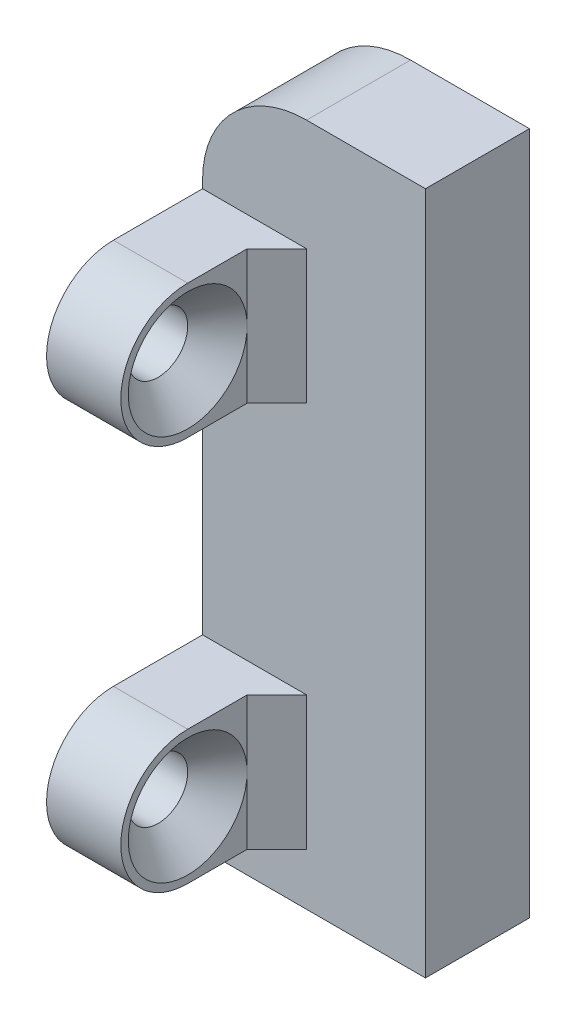
ISO-10303-21;
HEADER;
FILE_DESCRIPTION(('STEP AP214'),'2;1');
FILE_NAME('part.step','',(''),(''),'','','');
FILE_SCHEMA(('AUTOMOTIVE_DESIGN { 1 0 10303 214 1 1 1 1 }'));
ENDSEC;
DATA;
#1=APPLICATION_CONTEXT('core data for automotive mechanical design processes');
#2=APPLICATION_PROTOCOL_DEFINITION('international standard','automotive_design',2000,#1);
#3=PRODUCT_CONTEXT('',#1,'mechanical');
#4=PRODUCT('Part','Part','',(#3));
#5=PRODUCT_RELATED_PRODUCT_CATEGORY('part','',(#4));
#6=PRODUCT_DEFINITION_FORMATION('','',#4);
#7=PRODUCT_DEFINITION_CONTEXT('part definition',#1,'design');
#8=PRODUCT_DEFINITION('design','',#6,#7);
#9=PRODUCT_DEFINITION_SHAPE('','',#8);
#10=(LENGTH_UNIT() NAMED_UNIT(*) SI_UNIT(.MILLI.,.METRE.));
#11=(NAMED_UNIT(*) PLANE_ANGLE_UNIT() SI_UNIT($,.RADIAN.));
#12=(NAMED_UNIT(*) SI_UNIT($,.STERADIAN.) SOLID_ANGLE_UNIT());
#13=UNCERTAINTY_MEASURE_WITH_UNIT(LENGTH_MEASURE(1.E-05),#10,'distance_accuracy_value','');
#14=(GEOMETRIC_REPRESENTATION_CONTEXT(3) GLOBAL_UNCERTAINTY_ASSIGNED_CONTEXT((#13)) GLOBAL_UNIT_ASSIGNED_CONTEXT((#10,
#11,#12)) REPRESENTATION_CONTEXT('',''));
#15=CARTESIAN_POINT('',(0.,0.,0.));
#16=DIRECTION('',(0.,0.,1.));
#17=DIRECTION('',(1.,0.,0.));
#18=AXIS2_PLACEMENT_3D('',#15,#16,#17);
#19=CARTESIAN_POINT('',(14.,14.,7.));
#20=DIRECTION('',(0.,0.,1.));
#21=DIRECTION('',(1.,0.,0.));
#22=AXIS2_PLACEMENT_3D('',#19,#20,#21);
#23=PLANE('',#22);
#24=DIRECTION('',(-1.,0.,0.));
#25=VECTOR('',#24,1.);
#26=CARTESIAN_POINT('',(12.,-12.5000000000001,7.));
#27=LINE('',#26,#25);
#28=CARTESIAN_POINT('',(14.,-12.5000000000001,7.));
#29=VERTEX_POINT('',#28);
#30=CARTESIAN_POINT('',(6.99999999999999,-12.5000000000001,7.));
#31=VERTEX_POINT('',#30);
#32=EDGE_CURVE('E199',#29,#31,#27,.T.);
#33=ORIENTED_EDGE('',*,*,#32,.F.);
#34=DIRECTION('',(0.,-1.,0.));
#35=VECTOR('',#34,1.);
#36=CARTESIAN_POINT('',(14.,-21.5000000000001,7.));
#37=LINE('',#36,#35);
#38=CARTESIAN_POINT('',(14.,-21.5000000000001,7.));
#39=VERTEX_POINT('',#38);
#40=EDGE_CURVE('E291',#29,#39,#37,.T.);
#41=ORIENTED_EDGE('',*,*,#40,.T.);
#42=DIRECTION('',(-1.,0.,0.));
#43=VECTOR('',#42,1.);
#44=CARTESIAN_POINT('',(12.,-21.5000000000001,7.));
#45=LINE('',#44,#43);
#46=CARTESIAN_POINT('',(6.99999999999999,-21.5000000000001,7.));
#47=VERTEX_POINT('',#46);
#48=EDGE_CURVE('E184',#39,#47,#45,.T.);
#49=ORIENTED_EDGE('',*,*,#48,.T.);
#50=DIRECTION('',(0.,-1.,0.));
#51=VECTOR('',#50,1.);
#52=CARTESIAN_POINT('',(6.99999999999999,13.9999999999999,7.));
#53=LINE('',#52,#51);
#54=CARTESIAN_POINT('',(6.99999999999999,-25.,7.));
#55=VERTEX_POINT('',#54);
#56=EDGE_CURVE('E242',#47,#55,#53,.T.);
#57=ORIENTED_EDGE('',*,*,#56,.T.);
#58=DIRECTION('',(1.,0.,0.));
#59=VECTOR('',#58,1.);
#60=CARTESIAN_POINT('',(6.99999999999999,-25.,7.));
#61=LINE('',#60,#59);
#62=CARTESIAN_POINT('',(22.,-25.,7.));
#63=VERTEX_POINT('',#62);
#64=EDGE_CURVE('E246',#55,#63,#61,.T.);
#65=ORIENTED_EDGE('',*,*,#64,.T.);
#66=DIRECTION('',(0.,1.,0.));
#67=VECTOR('',#66,1.);
#68=CARTESIAN_POINT('',(22.,-25.,7.));
#69=LINE('',#68,#67);
#70=CARTESIAN_POINT('',(22.,21.,7.));
#71=VERTEX_POINT('',#70);
#72=EDGE_CURVE('E234',#63,#71,#69,.T.);
#73=ORIENTED_EDGE('',*,*,#72,.T.);
#74=DIRECTION('',(-1.,0.,0.));
#75=VECTOR('',#74,1.);
#76=CARTESIAN_POINT('',(22.,21.,7.));
#77=LINE('',#76,#75);
#78=CARTESIAN_POINT('',(14.,21.,7.));
#79=VERTEX_POINT('',#78);
#80=EDGE_CURVE('E237',#71,#79,#77,.T.);
#81=ORIENTED_EDGE('',*,*,#80,.T.);
#82=CARTESIAN_POINT('',(14.,14.,7.));
#83=DIRECTION('',(0.,0.,1.));
#84=DIRECTION('',(1.,0.,0.));
#85=AXIS2_PLACEMENT_3D('',#82,#83,#84);
#86=CIRCLE('',#85,7.00000000000001);
#87=CARTESIAN_POINT('',(6.99999999999999,13.9999999999999,7.));
#88=VERTEX_POINT('',#87);
#89=EDGE_CURVE('E240',#79,#88,#86,.T.);
#90=ORIENTED_EDGE('',*,*,#89,.T.);
#91=CARTESIAN_POINT('',(6.99999999999999,13.4999999999999,7.));
#92=VERTEX_POINT('',#91);
#93=EDGE_CURVE('E243',#88,#92,#53,.T.);
#94=ORIENTED_EDGE('',*,*,#93,.T.);
#95=DIRECTION('',(-1.,0.,0.));
#96=VECTOR('',#95,1.);
#97=CARTESIAN_POINT('',(12.,13.4999999999999,7.));
#98=LINE('',#97,#96);
#99=CARTESIAN_POINT('',(14.,13.4999999999999,7.));
#100=VERTEX_POINT('',#99);
#101=EDGE_CURVE('E225',#100,#92,#98,.T.);
#102=ORIENTED_EDGE('',*,*,#101,.F.);
#103=DIRECTION('',(0.,-1.,0.));
#104=VECTOR('',#103,1.);
#105=CARTESIAN_POINT('',(14.,4.49999999999993,7.));
#106=LINE('',#105,#104);
#107=CARTESIAN_POINT('',(14.,4.49999999999993,7.));
#108=VERTEX_POINT('',#107);
#109=EDGE_CURVE('E288',#100,#108,#106,.T.);
#110=ORIENTED_EDGE('',*,*,#109,.T.);
#111=DIRECTION('',(-1.,0.,0.));
#112=VECTOR('',#111,1.);
#113=CARTESIAN_POINT('',(12.,4.49999999999993,7.));
#114=LINE('',#113,#112);
#115=CARTESIAN_POINT('',(6.99999999999999,4.49999999999993,7.));
#116=VERTEX_POINT('',#115);
#117=EDGE_CURVE('E217',#108,#116,#114,.T.);
#118=ORIENTED_EDGE('',*,*,#117,.T.);
#119=EDGE_CURVE('E247',#116,#31,#53,.T.);
#120=ORIENTED_EDGE('',*,*,#119,.T.);
#121=EDGE_LOOP('',(#33,#41,#49,#57,#65,#73,#81,#90,#94,#102,#110,#118,#120));
#122=FACE_BOUND('',#121,.T.);
#123=ADVANCED_FACE('F48',(#122),#23,.T.);
#124=CARTESIAN_POINT('',(22.,-25.,7.));
#125=DIRECTION('',(-1.,0.,0.));
#126=DIRECTION('',(0.,0.,1.));
#127=AXIS2_PLACEMENT_3D('',#124,#125,#126);
#128=PLANE('',#127);
#129=DIRECTION('',(0.,1.,0.));
#130=VECTOR('',#129,1.);
#131=CARTESIAN_POINT('',(22.,-25.,0.));
#132=LINE('',#131,#130);
#133=CARTESIAN_POINT('',(22.,-25.,0.));
#134=VERTEX_POINT('',#133);
#135=CARTESIAN_POINT('',(22.,21.,0.));
#136=VERTEX_POINT('',#135);
#137=EDGE_CURVE('E227',#134,#136,#132,.T.);
#138=ORIENTED_EDGE('',*,*,#137,.T.);
#139=DIRECTION('',(0.,0.,-1.));
#140=VECTOR('',#139,1.);
#141=CARTESIAN_POINT('',(22.,21.,7.));
#142=LINE('',#141,#140);
#143=EDGE_CURVE('E270',#71,#136,#142,.T.);
#144=ORIENTED_EDGE('',*,*,#143,.F.);
#145=ORIENTED_EDGE('',*,*,#72,.F.);
#146=DIRECTION('',(0.,0.,-1.));
#147=VECTOR('',#146,1.);
#148=CARTESIAN_POINT('',(22.,-25.,7.));
#149=LINE('',#148,#147);
#150=EDGE_CURVE('E249',#63,#134,#149,.T.);
#151=ORIENTED_EDGE('',*,*,#150,.T.);
#152=EDGE_LOOP('',(#138,#144,#145,#151));
#153=FACE_BOUND('',#152,.T.);
#154=ADVANCED_FACE('F324',(#153),#128,.F.);
#155=CARTESIAN_POINT('',(22.,21.,7.));
#156=DIRECTION('',(0.,-1.,0.));
#157=DIRECTION('',(0.,0.,-1.));
#158=AXIS2_PLACEMENT_3D('',#155,#156,#157);
#159=PLANE('',#158);
#160=DIRECTION('',(-1.,0.,0.));
#161=VECTOR('',#160,1.);
#162=CARTESIAN_POINT('',(22.,21.,0.));
#163=LINE('',#162,#161);
#164=CARTESIAN_POINT('',(14.,21.,0.));
#165=VERTEX_POINT('',#164);
#166=EDGE_CURVE('E252',#136,#165,#163,.T.);
#167=ORIENTED_EDGE('',*,*,#166,.T.);
#168=DIRECTION('',(0.,0.,-1.));
#169=VECTOR('',#168,1.);
#170=CARTESIAN_POINT('',(14.,21.,7.));
#171=LINE('',#170,#169);
#172=EDGE_CURVE('E267',#79,#165,#171,.T.);
#173=ORIENTED_EDGE('',*,*,#172,.F.);
#174=ORIENTED_EDGE('',*,*,#80,.F.);
#175=ORIENTED_EDGE('',*,*,#143,.T.);
#176=EDGE_LOOP('',(#167,#173,#174,#175));
#177=FACE_BOUND('',#176,.T.);
#178=ADVANCED_FACE('F329',(#177),#159,.F.);
#179=CARTESIAN_POINT('',(14.,14.,7.));
#180=DIRECTION('',(0.,0.,-1.));
#181=DIRECTION('',(-1.,0.,0.));
#182=AXIS2_PLACEMENT_3D('',#179,#180,#181);
#183=CYLINDRICAL_SURFACE('',#182,7.00000000000001);
#184=CARTESIAN_POINT('',(14.,14.,0.));
#185=DIRECTION('',(0.,0.,1.));
#186=DIRECTION('',(1.,0.,0.));
#187=AXIS2_PLACEMENT_3D('',#184,#185,#186);
#188=CIRCLE('',#187,7.00000000000001);
#189=CARTESIAN_POINT('',(6.99999999999999,13.9999999999999,0.));
#190=VERTEX_POINT('',#189);
#191=EDGE_CURVE('E254',#165,#190,#188,.T.);
#192=ORIENTED_EDGE('',*,*,#191,.T.);
#193=DIRECTION('',(0.,0.,-1.));
#194=VECTOR('',#193,1.);
#195=CARTESIAN_POINT('',(6.99999999999999,13.9999999999999,7.));
#196=LINE('',#195,#194);
#197=EDGE_CURVE('E264',#88,#190,#196,.T.);
#198=ORIENTED_EDGE('',*,*,#197,.F.);
#199=ORIENTED_EDGE('',*,*,#89,.F.);
#200=ORIENTED_EDGE('',*,*,#172,.T.);
#201=EDGE_LOOP('',(#192,#198,#199,#200));
#202=FACE_BOUND('',#201,.T.);
#203=ADVANCED_FACE('F332',(#202),#183,.T.);
#204=CARTESIAN_POINT('',(6.99999999999999,13.9999999999999,7.));
#205=DIRECTION('',(1.,0.,0.));
#206=DIRECTION('',(0.,1.,0.));
#207=AXIS2_PLACEMENT_3D('',#204,#205,#206);
#208=PLANE('',#207);
#209=DIRECTION('',(0.,-1.,0.));
#210=VECTOR('',#209,1.);
#211=CARTESIAN_POINT('',(6.99999999999999,13.9999999999999,0.));
#212=LINE('',#211,#210);
#213=CARTESIAN_POINT('',(6.99999999999999,-25.,0.));
#214=VERTEX_POINT('',#213);
#215=EDGE_CURVE('E256',#190,#214,#212,.T.);
#216=ORIENTED_EDGE('',*,*,#215,.T.);
#217=DIRECTION('',(0.,0.,-1.));
#218=VECTOR('',#217,1.);
#219=CARTESIAN_POINT('',(6.99999999999999,-25.,7.));
#220=LINE('',#219,#218);
#221=EDGE_CURVE('E261',#55,#214,#220,.T.);
#222=ORIENTED_EDGE('',*,*,#221,.F.);
#223=ORIENTED_EDGE('',*,*,#56,.F.);
#224=DIRECTION('',(0.,0.,-1.));
#225=VECTOR('',#224,1.);
#226=CARTESIAN_POINT('',(6.99999999999999,-21.5000000000001,7.));
#227=LINE('',#226,#225);
#228=CARTESIAN_POINT('',(6.99999999999999,-21.5000000000001,13.));
#229=VERTEX_POINT('',#228);
#230=EDGE_CURVE('E196',#229,#47,#227,.T.);
#231=ORIENTED_EDGE('',*,*,#230,.F.);
#232=CARTESIAN_POINT('',(6.99999999999999,-17.0000000000001,13.));
#233=DIRECTION('',(1.,0.,0.));
#234=DIRECTION('',(0.,-1.,0.));
#235=AXIS2_PLACEMENT_3D('',#232,#233,#234);
#236=CIRCLE('',#235,4.5);
#237=CARTESIAN_POINT('',(6.99999999999999,-12.5000000000001,13.));
#238=VERTEX_POINT('',#237);
#239=EDGE_CURVE('E180',#238,#229,#236,.T.);
#240=ORIENTED_EDGE('',*,*,#239,.F.);
#241=DIRECTION('',(0.,0.,1.));
#242=VECTOR('',#241,1.);
#243=CARTESIAN_POINT('',(6.99999999999999,-12.5000000000001,7.));
#244=LINE('',#243,#242);
#245=EDGE_CURVE('E189',#31,#238,#244,.T.);
#246=ORIENTED_EDGE('',*,*,#245,.F.);
#247=ORIENTED_EDGE('',*,*,#119,.F.);
#248=DIRECTION('',(0.,0.,1.));
#249=VECTOR('',#248,1.);
#250=CARTESIAN_POINT('',(6.99999999999999,4.49999999999993,7.));
#251=LINE('',#250,#249);
#252=CARTESIAN_POINT('',(6.99999999999999,4.49999999999993,13.));
#253=VERTEX_POINT('',#252);
#254=EDGE_CURVE('E208',#116,#253,#251,.T.);
#255=ORIENTED_EDGE('',*,*,#254,.T.);
#256=CARTESIAN_POINT('',(6.99999999999999,8.99999999999993,13.));
#257=DIRECTION('',(-1.,0.,0.));
#258=DIRECTION('',(0.,1.,0.));
#259=AXIS2_PLACEMENT_3D('',#256,#257,#258);
#260=CIRCLE('',#259,4.5);
#261=CARTESIAN_POINT('',(6.99999999999999,13.4999999999999,13.));
#262=VERTEX_POINT('',#261);
#263=EDGE_CURVE('E220',#253,#262,#260,.T.);
#264=ORIENTED_EDGE('',*,*,#263,.T.);
#265=DIRECTION('',(0.,0.,-1.));
#266=VECTOR('',#265,1.);
#267=CARTESIAN_POINT('',(6.99999999999999,13.4999999999999,7.));
#268=LINE('',#267,#266);
#269=EDGE_CURVE('E212',#262,#92,#268,.T.);
#270=ORIENTED_EDGE('',*,*,#269,.T.);
#271=ORIENTED_EDGE('',*,*,#93,.F.);
#272=ORIENTED_EDGE('',*,*,#197,.T.);
#273=EDGE_LOOP('',(#216,#222,#223,#231,#240,#246,#247,#255,#264,#270,#271,#272));
#274=FACE_BOUND('',#273,.T.);
#275=CARTESIAN_POINT('',(6.99999999999999,8.99999999999993,13.));
#276=DIRECTION('',(-1.,0.,0.));
#277=DIRECTION('',(0.,-1.,0.));
#278=AXIS2_PLACEMENT_3D('',#275,#276,#277);
#279=CIRCLE('',#278,2.);
#280=CARTESIAN_POINT('',(6.99999999999999,6.99999999999993,13.));
#281=VERTEX_POINT('',#280);
#282=EDGE_CURVE('E202',#281,#281,#279,.T.);
#283=ORIENTED_EDGE('',*,*,#282,.F.);
#284=EDGE_LOOP('',(#283));
#285=FACE_BOUND('',#284,.T.);
#286=CARTESIAN_POINT('',(6.99999999999999,-17.0000000000001,13.));
#287=DIRECTION('',(1.,0.,0.));
#288=DIRECTION('',(0.,1.,0.));
#289=AXIS2_PLACEMENT_3D('',#286,#287,#288);
#290=CIRCLE('',#289,2.);
#291=CARTESIAN_POINT('',(6.99999999999999,-15.0000000000001,13.));
#292=VERTEX_POINT('',#291);
#293=EDGE_CURVE('E193',#292,#292,#290,.T.);
#294=ORIENTED_EDGE('',*,*,#293,.T.);
#295=EDGE_LOOP('',(#294));
#296=FACE_BOUND('',#295,.T.);
#297=ADVANCED_FACE('F314',(#274,#285,#296),#208,.F.);
#298=CARTESIAN_POINT('',(6.99999999999999,-25.,7.));
#299=DIRECTION('',(0.,1.,0.));
#300=DIRECTION('',(0.,0.,1.));
#301=AXIS2_PLACEMENT_3D('',#298,#299,#300);
#302=PLANE('',#301);
#303=DIRECTION('',(1.,0.,0.));
#304=VECTOR('',#303,1.);
#305=CARTESIAN_POINT('',(6.99999999999999,-25.,0.));
#306=LINE('',#305,#304);
#307=EDGE_CURVE('E238',#214,#134,#306,.T.);
#308=ORIENTED_EDGE('',*,*,#307,.T.);
#309=ORIENTED_EDGE('',*,*,#150,.F.);
#310=ORIENTED_EDGE('',*,*,#64,.F.);
#311=ORIENTED_EDGE('',*,*,#221,.T.);
#312=EDGE_LOOP('',(#308,#309,#310,#311));
#313=FACE_BOUND('',#312,.T.);
#314=ADVANCED_FACE('F319',(#313),#302,.F.);
#315=CARTESIAN_POINT('',(14.,14.,0.));
#316=DIRECTION('',(0.,0.,1.));
#317=DIRECTION('',(1.,0.,0.));
#318=AXIS2_PLACEMENT_3D('',#315,#316,#317);
#319=PLANE('',#318);
#320=ORIENTED_EDGE('',*,*,#137,.F.);
#321=ORIENTED_EDGE('',*,*,#307,.F.);
#322=ORIENTED_EDGE('',*,*,#215,.F.);
#323=ORIENTED_EDGE('',*,*,#191,.F.);
#324=ORIENTED_EDGE('',*,*,#166,.F.);
#325=EDGE_LOOP('',(#320,#321,#322,#323,#324));
#326=FACE_BOUND('',#325,.T.);
#327=ADVANCED_FACE('F356',(#326),#319,.F.);
#328=CARTESIAN_POINT('',(12.,13.4999999999999,7.));
#329=DIRECTION('',(0.,1.,0.));
#330=DIRECTION('',(0.,0.,1.));
#331=AXIS2_PLACEMENT_3D('',#328,#329,#330);
#332=PLANE('',#331);
#333=ORIENTED_EDGE('',*,*,#269,.F.);
#334=DIRECTION('',(-1.,0.,0.));
#335=VECTOR('',#334,1.);
#336=CARTESIAN_POINT('',(12.,13.4999999999999,13.));
#337=LINE('',#336,#335);
#338=CARTESIAN_POINT('',(12.,13.4999999999999,13.));
#339=VERTEX_POINT('',#338);
#340=EDGE_CURVE('E228',#339,#262,#337,.T.);
#341=ORIENTED_EDGE('',*,*,#340,.F.);
#342=DIRECTION('',(0.,0.,-1.));
#343=VECTOR('',#342,1.);
#344=CARTESIAN_POINT('',(12.,13.4999999999999,7.));
#345=LINE('',#344,#343);
#346=CARTESIAN_POINT('',(12.,13.4999999999999,8.99999999999999));
#347=VERTEX_POINT('',#346);
#348=EDGE_CURVE('E215',#339,#347,#345,.T.);
#349=ORIENTED_EDGE('',*,*,#348,.T.);
#350=DIRECTION('',(-0.707106781186551,0.,0.707106781186544));
#351=VECTOR('',#350,1.);
#352=CARTESIAN_POINT('',(14.,13.4999999999999,7.));
#353=LINE('',#352,#351);
#354=EDGE_CURVE('E13',#347,#100,#353,.F.);
#355=ORIENTED_EDGE('',*,*,#354,.T.);
#356=ORIENTED_EDGE('',*,*,#101,.T.);
#357=EDGE_LOOP('',(#333,#341,#349,#355,#356));
#358=FACE_BOUND('',#357,.T.);
#359=ADVANCED_FACE('F338',(#358),#332,.T.);
#360=CARTESIAN_POINT('',(12.,8.99999999999993,13.));
#361=DIRECTION('',(-1.,0.,0.));
#362=DIRECTION('',(0.,-1.,0.));
#363=AXIS2_PLACEMENT_3D('',#360,#361,#362);
#364=CYLINDRICAL_SURFACE('',#363,4.5);
#365=ORIENTED_EDGE('',*,*,#263,.F.);
#366=DIRECTION('',(-1.,0.,0.));
#367=VECTOR('',#366,1.);
#368=CARTESIAN_POINT('',(12.,4.49999999999993,13.));
#369=LINE('',#368,#367);
#370=CARTESIAN_POINT('',(12.,4.49999999999993,13.));
#371=VERTEX_POINT('',#370);
#372=EDGE_CURVE('E230',#371,#253,#369,.T.);
#373=ORIENTED_EDGE('',*,*,#372,.F.);
#374=CARTESIAN_POINT('',(12.,8.99999999999993,13.));
#375=DIRECTION('',(-1.,0.,0.));
#376=DIRECTION('',(0.,1.,0.));
#377=AXIS2_PLACEMENT_3D('',#374,#375,#376);
#378=CIRCLE('',#377,4.5);
#379=EDGE_CURVE('E211',#371,#339,#378,.T.);
#380=ORIENTED_EDGE('',*,*,#379,.T.);
#381=ORIENTED_EDGE('',*,*,#340,.T.);
#382=EDGE_LOOP('',(#365,#373,#380,#381));
#383=FACE_BOUND('',#382,.T.);
#384=ADVANCED_FACE('F348',(#383),#364,.T.);
#385=CARTESIAN_POINT('',(12.,4.49999999999993,7.));
#386=DIRECTION('',(0.,-1.,0.));
#387=DIRECTION('',(1.,0.,0.));
#388=AXIS2_PLACEMENT_3D('',#385,#386,#387);
#389=PLANE('',#388);
#390=ORIENTED_EDGE('',*,*,#254,.F.);
#391=ORIENTED_EDGE('',*,*,#117,.F.);
#392=DIRECTION('',(0.707106781186551,0.,-0.707106781186544));
#393=VECTOR('',#392,1.);
#394=CARTESIAN_POINT('',(14.,4.49999999999993,7.));
#395=LINE('',#394,#393);
#396=CARTESIAN_POINT('',(12.,4.49999999999993,8.99999999999999));
#397=VERTEX_POINT('',#396);
#398=EDGE_CURVE('E57',#108,#397,#395,.F.);
#399=ORIENTED_EDGE('',*,*,#398,.T.);
#400=DIRECTION('',(0.,0.,1.));
#401=VECTOR('',#400,1.);
#402=CARTESIAN_POINT('',(12.,4.49999999999993,7.));
#403=LINE('',#402,#401);
#404=EDGE_CURVE('E209',#397,#371,#403,.T.);
#405=ORIENTED_EDGE('',*,*,#404,.T.);
#406=ORIENTED_EDGE('',*,*,#372,.T.);
#407=EDGE_LOOP('',(#390,#391,#399,#405,#406));
#408=FACE_BOUND('',#407,.T.);
#409=ADVANCED_FACE('F345',(#408),#389,.T.);
#410=CARTESIAN_POINT('',(12.,8.99999999999993,13.));
#411=DIRECTION('',(1.,0.,0.));
#412=DIRECTION('',(0.,1.,0.));
#413=AXIS2_PLACEMENT_3D('',#410,#411,#412);
#414=PLANE('',#413);
#415=ORIENTED_EDGE('',*,*,#404,.F.);
#416=DIRECTION('',(0.,1.,0.));
#417=VECTOR('',#416,1.);
#418=CARTESIAN_POINT('',(12.,13.4999999999999,8.99999999999999));
#419=LINE('',#418,#417);
#420=CARTESIAN_POINT('',(12.,8.99999999999993,8.99999999999999));
#421=VERTEX_POINT('',#420);
#422=EDGE_CURVE('E295',#397,#421,#419,.T.);
#423=ORIENTED_EDGE('',*,*,#422,.T.);
#424=CARTESIAN_POINT('',(12.,8.99999999999993,13.));
#425=DIRECTION('',(1.,0.,0.));
#426=DIRECTION('',(0.,1.,0.));
#427=AXIS2_PLACEMENT_3D('',#424,#425,#426);
#428=CIRCLE('',#427,4.00000000000001);
#429=EDGE_CURVE('E279',#421,#421,#428,.F.);
#430=ORIENTED_EDGE('',*,*,#429,.T.);
#431=DIRECTION('',(0.,1.,0.));
#432=VECTOR('',#431,1.);
#433=CARTESIAN_POINT('',(12.,13.4999999999999,8.99999999999999));
#434=LINE('',#433,#432);
#435=EDGE_CURVE('E71',#421,#347,#434,.T.);
#436=ORIENTED_EDGE('',*,*,#435,.T.);
#437=ORIENTED_EDGE('',*,*,#348,.F.);
#438=ORIENTED_EDGE('',*,*,#379,.F.);
#439=EDGE_LOOP('',(#415,#423,#430,#436,#437,#438));
#440=FACE_BOUND('',#439,.T.);
#441=ADVANCED_FACE('F341',(#440),#414,.T.);
#442=CARTESIAN_POINT('',(12.,8.99999999999993,13.));
#443=DIRECTION('',(-1.,0.,0.));
#444=DIRECTION('',(0.,-1.,0.));
#445=AXIS2_PLACEMENT_3D('',#442,#443,#444);
#446=CYLINDRICAL_SURFACE('',#445,2.);
#447=CARTESIAN_POINT('',(9.99999999999997,8.99999999999993,13.));
#448=DIRECTION('',(1.,0.,0.));
#449=DIRECTION('',(0.,0.,-1.));
#450=AXIS2_PLACEMENT_3D('',#447,#448,#449);
#451=CIRCLE('',#450,2.);
#452=CARTESIAN_POINT('',(9.99999999999997,8.99999999999993,11.));
#453=VERTEX_POINT('',#452);
#454=EDGE_CURVE('E281',#453,#453,#451,.T.);
#455=ORIENTED_EDGE('',*,*,#454,.T.);
#456=EDGE_LOOP('',(#455));
#457=FACE_BOUND('',#456,.T.);
#458=ORIENTED_EDGE('',*,*,#282,.T.);
#459=EDGE_LOOP('',(#458));
#460=FACE_BOUND('',#459,.T.);
#461=ADVANCED_FACE('F444',(#457,#460),#446,.F.);
#462=CARTESIAN_POINT('',(12.,-17.0000000000001,13.));
#463=DIRECTION('',(1.,0.,0.));
#464=DIRECTION('',(0.,-1.,0.));
#465=AXIS2_PLACEMENT_3D('',#462,#463,#464);
#466=PLANE('',#465);
#467=DIRECTION('',(0.,0.,-1.));
#468=VECTOR('',#467,1.);
#469=CARTESIAN_POINT('',(12.,-21.5000000000001,7.));
#470=LINE('',#469,#468);
#471=CARTESIAN_POINT('',(12.,-21.5000000000001,13.));
#472=VERTEX_POINT('',#471);
#473=CARTESIAN_POINT('',(12.,-21.5000000000001,9.00000000000001));
#474=VERTEX_POINT('',#473);
#475=EDGE_CURVE('E168',#472,#474,#470,.T.);
#476=ORIENTED_EDGE('',*,*,#475,.T.);
#477=DIRECTION('',(0.,1.,0.));
#478=VECTOR('',#477,1.);
#479=CARTESIAN_POINT('',(12.,-12.5000000000001,9.00000000000001));
#480=LINE('',#479,#478);
#481=CARTESIAN_POINT('',(12.,-17.0000000000001,9.00000000000001));
#482=VERTEX_POINT('',#481);
#483=EDGE_CURVE('E286',#474,#482,#480,.T.);
#484=ORIENTED_EDGE('',*,*,#483,.T.);
#485=CARTESIAN_POINT('',(12.,-17.0000000000001,13.));
#486=DIRECTION('',(1.,0.,0.));
#487=DIRECTION('',(0.,1.,0.));
#488=AXIS2_PLACEMENT_3D('',#485,#486,#487);
#489=CIRCLE('',#488,4.00000000000001);
#490=EDGE_CURVE('E276',#482,#482,#489,.F.);
#491=ORIENTED_EDGE('',*,*,#490,.T.);
#492=DIRECTION('',(0.,1.,0.));
#493=VECTOR('',#492,1.);
#494=CARTESIAN_POINT('',(12.,-12.5000000000001,9.00000000000001));
#495=LINE('',#494,#493);
#496=CARTESIAN_POINT('',(12.,-12.5000000000001,9.00000000000001));
#497=VERTEX_POINT('',#496);
#498=EDGE_CURVE('E284',#482,#497,#495,.T.);
#499=ORIENTED_EDGE('',*,*,#498,.T.);
#500=DIRECTION('',(0.,0.,1.));
#501=VECTOR('',#500,1.);
#502=CARTESIAN_POINT('',(12.,-12.5000000000001,7.));
#503=LINE('',#502,#501);
#504=CARTESIAN_POINT('',(12.,-12.5000000000001,13.));
#505=VERTEX_POINT('',#504);
#506=EDGE_CURVE('E171',#497,#505,#503,.T.);
#507=ORIENTED_EDGE('',*,*,#506,.T.);
#508=CARTESIAN_POINT('',(12.,-17.0000000000001,13.));
#509=DIRECTION('',(1.,0.,0.));
#510=DIRECTION('',(0.,-1.,0.));
#511=AXIS2_PLACEMENT_3D('',#508,#509,#510);
#512=CIRCLE('',#511,4.5);
#513=EDGE_CURVE('E163',#505,#472,#512,.T.);
#514=ORIENTED_EDGE('',*,*,#513,.T.);
#515=EDGE_LOOP('',(#476,#484,#491,#499,#507,#514));
#516=FACE_BOUND('',#515,.T.);
#517=ADVANCED_FACE('F165',(#516),#466,.T.);
#518=CARTESIAN_POINT('',(12.,-12.5000000000001,7.));
#519=DIRECTION('',(0.,-1.,0.));
#520=DIRECTION('',(0.,0.,-1.));
#521=AXIS2_PLACEMENT_3D('',#518,#519,#520);
#522=PLANE('',#521);
#523=ORIENTED_EDGE('',*,*,#245,.T.);
#524=DIRECTION('',(-1.,0.,0.));
#525=VECTOR('',#524,1.);
#526=CARTESIAN_POINT('',(12.,-12.5000000000001,13.));
#527=LINE('',#526,#525);
#528=EDGE_CURVE('E183',#505,#238,#527,.T.);
#529=ORIENTED_EDGE('',*,*,#528,.F.);
#530=ORIENTED_EDGE('',*,*,#506,.F.);
#531=DIRECTION('',(-0.707106781186546,0.,0.707106781186549));
#532=VECTOR('',#531,1.);
#533=CARTESIAN_POINT('',(13.,-12.5000000000001,8.));
#534=LINE('',#533,#532);
#535=EDGE_CURVE('E297',#497,#29,#534,.F.);
#536=ORIENTED_EDGE('',*,*,#535,.T.);
#537=ORIENTED_EDGE('',*,*,#32,.T.);
#538=EDGE_LOOP('',(#523,#529,#530,#536,#537));
#539=FACE_BOUND('',#538,.T.);
#540=ADVANCED_FACE('F303',(#539),#522,.F.);
#541=CARTESIAN_POINT('',(12.,-17.0000000000001,13.));
#542=DIRECTION('',(-1.,0.,0.));
#543=DIRECTION('',(0.,-1.,0.));
#544=AXIS2_PLACEMENT_3D('',#541,#542,#543);
#545=CYLINDRICAL_SURFACE('',#544,4.5);
#546=ORIENTED_EDGE('',*,*,#239,.T.);
#547=DIRECTION('',(-1.,0.,0.));
#548=VECTOR('',#547,1.);
#549=CARTESIAN_POINT('',(12.,-21.5000000000001,13.));
#550=LINE('',#549,#548);
#551=EDGE_CURVE('E177',#472,#229,#550,.T.);
#552=ORIENTED_EDGE('',*,*,#551,.F.);
#553=ORIENTED_EDGE('',*,*,#513,.F.);
#554=ORIENTED_EDGE('',*,*,#528,.T.);
#555=EDGE_LOOP('',(#546,#552,#553,#554));
#556=FACE_BOUND('',#555,.T.);
#557=ADVANCED_FACE('F178',(#556),#545,.T.);
#558=CARTESIAN_POINT('',(12.,-21.5000000000001,7.));
#559=DIRECTION('',(0.,1.,0.));
#560=DIRECTION('',(0.,0.,1.));
#561=AXIS2_PLACEMENT_3D('',#558,#559,#560);
#562=PLANE('',#561);
#563=ORIENTED_EDGE('',*,*,#230,.T.);
#564=ORIENTED_EDGE('',*,*,#48,.F.);
#565=DIRECTION('',(0.707106781186546,0.,-0.707106781186549));
#566=VECTOR('',#565,1.);
#567=CARTESIAN_POINT('',(13.,-21.5000000000001,8.));
#568=LINE('',#567,#566);
#569=EDGE_CURVE('E188',#39,#474,#568,.F.);
#570=ORIENTED_EDGE('',*,*,#569,.T.);
#571=ORIENTED_EDGE('',*,*,#475,.F.);
#572=ORIENTED_EDGE('',*,*,#551,.T.);
#573=EDGE_LOOP('',(#563,#564,#570,#571,#572));
#574=FACE_BOUND('',#573,.T.);
#575=ADVANCED_FACE('F186',(#574),#562,.F.);
#576=CARTESIAN_POINT('',(12.,-17.0000000000001,13.));
#577=DIRECTION('',(-1.,0.,0.));
#578=DIRECTION('',(0.,-1.,0.));
#579=AXIS2_PLACEMENT_3D('',#576,#577,#578);
#580=CYLINDRICAL_SURFACE('',#579,2.);
#581=CARTESIAN_POINT('',(9.99999999999999,-17.0000000000001,13.));
#582=DIRECTION('',(1.,0.,0.));
#583=DIRECTION('',(0.,0.,-1.));
#584=AXIS2_PLACEMENT_3D('',#581,#582,#583);
#585=CIRCLE('',#584,2.);
#586=CARTESIAN_POINT('',(9.99999999999999,-17.0000000000001,11.));
#587=VERTEX_POINT('',#586);
#588=EDGE_CURVE('E273',#587,#587,#585,.T.);
#589=ORIENTED_EDGE('',*,*,#588,.T.);
#590=EDGE_LOOP('',(#589));
#591=FACE_BOUND('',#590,.T.);
#592=ORIENTED_EDGE('',*,*,#293,.F.);
#593=EDGE_LOOP('',(#592));
#594=FACE_BOUND('',#593,.T.);
#595=ADVANCED_FACE('F384',(#591,#594),#580,.F.);
#596=CARTESIAN_POINT('',(9.99999999999999,-17.0000000000001,13.));
#597=DIRECTION('',(1.,0.,0.));
#598=DIRECTION('',(0.,0.,-1.));
#599=AXIS2_PLACEMENT_3D('',#596,#597,#598);
#600=CONICAL_SURFACE('',#599,2.,0.785398163397451);
#601=ORIENTED_EDGE('',*,*,#490,.F.);
#602=EDGE_LOOP('',(#601));
#603=FACE_BOUND('',#602,.T.);
#604=ORIENTED_EDGE('',*,*,#588,.F.);
#605=EDGE_LOOP('',(#604));
#606=FACE_BOUND('',#605,.T.);
#607=ADVANCED_FACE('F377',(#603,#606),#600,.F.);
#608=CARTESIAN_POINT('',(12.,8.99999999999993,13.));
#609=DIRECTION('',(1.,0.,0.));
#610=DIRECTION('',(0.,0.,-1.));
#611=AXIS2_PLACEMENT_3D('',#608,#609,#610);
#612=CONICAL_SURFACE('',#611,4.00000000000001,0.785398163397447);
#613=ORIENTED_EDGE('',*,*,#454,.F.);
#614=EDGE_LOOP('',(#613));
#615=FACE_BOUND('',#614,.T.);
#616=ORIENTED_EDGE('',*,*,#429,.F.);
#617=EDGE_LOOP('',(#616));
#618=FACE_BOUND('',#617,.T.);
#619=ADVANCED_FACE('F383',(#615,#618),#612,.F.);
#620=CARTESIAN_POINT('',(12.,-17.0000000000001,9.00000000000001));
#621=DIRECTION('',(0.707106781186549,0.,0.707106781186546));
#622=DIRECTION('',(0.,-1.,0.));
#623=AXIS2_PLACEMENT_3D('',#620,#621,#622);
#624=PLANE('',#623);
#625=ORIENTED_EDGE('',*,*,#569,.F.);
#626=ORIENTED_EDGE('',*,*,#40,.F.);
#627=ORIENTED_EDGE('',*,*,#535,.F.);
#628=ORIENTED_EDGE('',*,*,#498,.F.);
#629=ORIENTED_EDGE('',*,*,#483,.F.);
#630=EDGE_LOOP('',(#625,#626,#627,#628,#629));
#631=FACE_BOUND('',#630,.T.);
#632=ADVANCED_FACE('F306',(#631),#624,.T.);
#633=CARTESIAN_POINT('',(14.,14.,7.));
#634=DIRECTION('',(0.707106781186544,0.,0.707106781186551));
#635=DIRECTION('',(0.,1.,0.));
#636=AXIS2_PLACEMENT_3D('',#633,#634,#635);
#637=PLANE('',#636);
#638=ORIENTED_EDGE('',*,*,#435,.F.);
#639=ORIENTED_EDGE('',*,*,#422,.F.);
#640=ORIENTED_EDGE('',*,*,#398,.F.);
#641=ORIENTED_EDGE('',*,*,#109,.F.);
#642=ORIENTED_EDGE('',*,*,#354,.F.);
#643=EDGE_LOOP('',(#638,#639,#640,#641,#642));
#644=FACE_BOUND('',#643,.T.);
#645=ADVANCED_FACE('F51',(#644),#637,.T.);
#646=CLOSED_SHELL('',(#123,#154,#178,#203,#297,#314,#327,#359,#384,#409,#441,#461,#517,#540,
#557,#575,#595,#607,#619,#632,#645));
#647=MANIFOLD_SOLID_BREP('B2',#646);
#648=ADVANCED_BREP_SHAPE_REPRESENTATION('',(#18,#647),#14);
#649=SHAPE_DEFINITION_REPRESENTATION(#9,#648);
ENDSEC;
END-ISO-10303-21;
